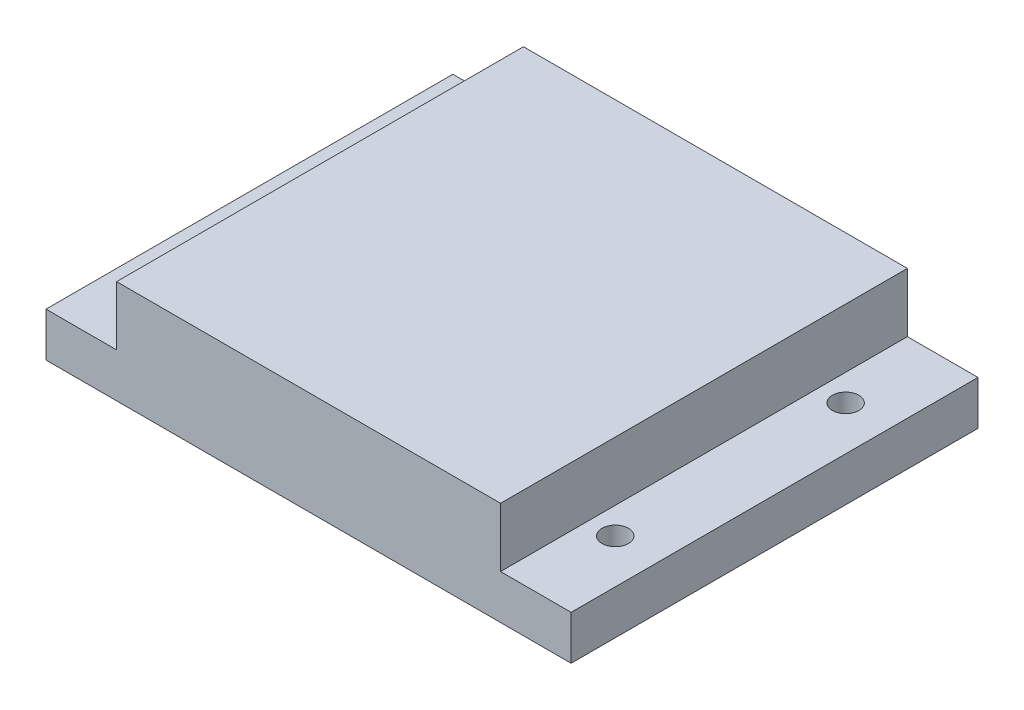
ISO-10303-21;
HEADER;
FILE_DESCRIPTION(('STEP AP214'),'2;1');
FILE_NAME('part.step','',(''),(''),'','','');
FILE_SCHEMA(('AUTOMOTIVE_DESIGN { 1 0 10303 214 1 1 1 1 }'));
ENDSEC;
DATA;
#1=APPLICATION_CONTEXT('core data for automotive mechanical design processes');
#2=APPLICATION_PROTOCOL_DEFINITION('international standard','automotive_design',2000,#1);
#3=PRODUCT_CONTEXT('',#1,'mechanical');
#4=PRODUCT('Part','Part','',(#3));
#5=PRODUCT_RELATED_PRODUCT_CATEGORY('part','',(#4));
#6=PRODUCT_DEFINITION_FORMATION('','',#4);
#7=PRODUCT_DEFINITION_CONTEXT('part definition',#1,'design');
#8=PRODUCT_DEFINITION('design','',#6,#7);
#9=PRODUCT_DEFINITION_SHAPE('','',#8);
#10=(LENGTH_UNIT() NAMED_UNIT(*) SI_UNIT(.MILLI.,.METRE.));
#11=(NAMED_UNIT(*) PLANE_ANGLE_UNIT() SI_UNIT($,.RADIAN.));
#12=(NAMED_UNIT(*) SI_UNIT($,.STERADIAN.) SOLID_ANGLE_UNIT());
#13=UNCERTAINTY_MEASURE_WITH_UNIT(LENGTH_MEASURE(1.E-05),#10,'distance_accuracy_value','');
#14=(GEOMETRIC_REPRESENTATION_CONTEXT(3) GLOBAL_UNCERTAINTY_ASSIGNED_CONTEXT((#13)) GLOBAL_UNIT_ASSIGNED_CONTEXT((#10,
#11,#12)) REPRESENTATION_CONTEXT('',''));
#15=CARTESIAN_POINT('',(0.,0.,0.));
#16=DIRECTION('',(0.,0.,1.));
#17=DIRECTION('',(1.,0.,0.));
#18=AXIS2_PLACEMENT_3D('',#15,#16,#17);
#19=CARTESIAN_POINT('',(0.,0.,46.1));
#20=DIRECTION('',(0.,1.,0.));
#21=DIRECTION('',(0.,0.,1.));
#22=AXIS2_PLACEMENT_3D('',#19,#20,#21);
#23=PLANE('',#22);
#24=CARTESIAN_POINT('',(5.,0.,10.));
#25=DIRECTION('',(0.,-1.,0.));
#26=DIRECTION('',(0.,0.,-1.));
#27=AXIS2_PLACEMENT_3D('',#24,#25,#26);
#28=CIRCLE('',#27,1.5);
#29=CARTESIAN_POINT('',(5.,0.,8.5));
#30=VERTEX_POINT('',#29);
#31=EDGE_CURVE('E198',#30,#30,#28,.T.);
#32=ORIENTED_EDGE('',*,*,#31,.F.);
#33=EDGE_LOOP('',(#32));
#34=FACE_BOUND('',#33,.T.);
#35=CARTESIAN_POINT('',(54.5,0.,36.1));
#36=DIRECTION('',(0.,-1.,0.));
#37=DIRECTION('',(0.,0.,-1.));
#38=AXIS2_PLACEMENT_3D('',#35,#36,#37);
#39=CIRCLE('',#38,1.5);
#40=CARTESIAN_POINT('',(54.5,0.,34.6));
#41=VERTEX_POINT('',#40);
#42=EDGE_CURVE('E201',#41,#41,#39,.T.);
#43=ORIENTED_EDGE('',*,*,#42,.F.);
#44=EDGE_LOOP('',(#43));
#45=FACE_BOUND('',#44,.T.);
#46=CARTESIAN_POINT('',(54.5,0.,10.));
#47=DIRECTION('',(0.,-1.,0.));
#48=DIRECTION('',(0.,0.,-1.));
#49=AXIS2_PLACEMENT_3D('',#46,#47,#48);
#50=CIRCLE('',#49,1.5);
#51=CARTESIAN_POINT('',(54.5,0.,8.5));
#52=VERTEX_POINT('',#51);
#53=EDGE_CURVE('E205',#52,#52,#50,.T.);
#54=ORIENTED_EDGE('',*,*,#53,.F.);
#55=EDGE_LOOP('',(#54));
#56=FACE_BOUND('',#55,.T.);
#57=CARTESIAN_POINT('',(5.,0.,36.1));
#58=DIRECTION('',(0.,-1.,0.));
#59=DIRECTION('',(0.,0.,-1.));
#60=AXIS2_PLACEMENT_3D('',#57,#58,#59);
#61=CIRCLE('',#60,1.5);
#62=CARTESIAN_POINT('',(5.,0.,34.6));
#63=VERTEX_POINT('',#62);
#64=EDGE_CURVE('E164',#63,#63,#61,.T.);
#65=ORIENTED_EDGE('',*,*,#64,.F.);
#66=EDGE_LOOP('',(#65));
#67=FACE_BOUND('',#66,.T.);
#68=DIRECTION('',(1.,0.,0.));
#69=VECTOR('',#68,1.);
#70=CARTESIAN_POINT('',(0.,0.,0.));
#71=LINE('',#70,#69);
#72=CARTESIAN_POINT('',(0.,0.,0.));
#73=VERTEX_POINT('',#72);
#74=CARTESIAN_POINT('',(59.5,0.,0.));
#75=VERTEX_POINT('',#74);
#76=EDGE_CURVE('E134',#73,#75,#71,.T.);
#77=ORIENTED_EDGE('',*,*,#76,.T.);
#78=DIRECTION('',(0.,0.,-1.));
#79=VECTOR('',#78,1.);
#80=CARTESIAN_POINT('',(59.5,0.,46.1));
#81=LINE('',#80,#79);
#82=CARTESIAN_POINT('',(59.5,0.,46.1));
#83=VERTEX_POINT('',#82);
#84=EDGE_CURVE('E11',#83,#75,#81,.T.);
#85=ORIENTED_EDGE('',*,*,#84,.F.);
#86=DIRECTION('',(1.,0.,0.));
#87=VECTOR('',#86,1.);
#88=CARTESIAN_POINT('',(0.,0.,46.1));
#89=LINE('',#88,#87);
#90=CARTESIAN_POINT('',(0.,0.,46.1));
#91=VERTEX_POINT('',#90);
#92=EDGE_CURVE('E148',#91,#83,#89,.T.);
#93=ORIENTED_EDGE('',*,*,#92,.F.);
#94=DIRECTION('',(0.,0.,-1.));
#95=VECTOR('',#94,1.);
#96=CARTESIAN_POINT('',(0.,0.,46.1));
#97=LINE('',#96,#95);
#98=EDGE_CURVE('E130',#91,#73,#97,.T.);
#99=ORIENTED_EDGE('',*,*,#98,.T.);
#100=EDGE_LOOP('',(#77,#85,#93,#99));
#101=FACE_BOUND('',#100,.T.);
#102=ADVANCED_FACE('F36',(#34,#45,#56,#67,#101),#23,.F.);
#103=CARTESIAN_POINT('',(59.5,0.,46.1));
#104=DIRECTION('',(-1.,0.,0.));
#105=DIRECTION('',(0.,0.,1.));
#106=AXIS2_PLACEMENT_3D('',#103,#104,#105);
#107=PLANE('',#106);
#108=DIRECTION('',(0.,1.,0.));
#109=VECTOR('',#108,1.);
#110=CARTESIAN_POINT('',(59.5,0.,0.));
#111=LINE('',#110,#109);
#112=CARTESIAN_POINT('',(59.5,5.,0.));
#113=VERTEX_POINT('',#112);
#114=EDGE_CURVE('E137',#75,#113,#111,.T.);
#115=ORIENTED_EDGE('',*,*,#114,.T.);
#116=DIRECTION('',(0.,0.,-1.));
#117=VECTOR('',#116,1.);
#118=CARTESIAN_POINT('',(59.5,5.,46.1));
#119=LINE('',#118,#117);
#120=CARTESIAN_POINT('',(59.5,5.,46.1));
#121=VERTEX_POINT('',#120);
#122=EDGE_CURVE('E45',#121,#113,#119,.T.);
#123=ORIENTED_EDGE('',*,*,#122,.F.);
#124=DIRECTION('',(0.,1.,0.));
#125=VECTOR('',#124,1.);
#126=CARTESIAN_POINT('',(59.5,0.,46.1));
#127=LINE('',#126,#125);
#128=EDGE_CURVE('E97',#83,#121,#127,.T.);
#129=ORIENTED_EDGE('',*,*,#128,.F.);
#130=ORIENTED_EDGE('',*,*,#84,.T.);
#131=EDGE_LOOP('',(#115,#123,#129,#130));
#132=FACE_BOUND('',#131,.T.);
#133=ADVANCED_FACE('F190',(#132),#107,.F.);
#134=CARTESIAN_POINT('',(59.5,5.,46.1));
#135=DIRECTION('',(0.,-1.,0.));
#136=DIRECTION('',(0.,0.,-1.));
#137=AXIS2_PLACEMENT_3D('',#134,#135,#136);
#138=PLANE('',#137);
#139=CARTESIAN_POINT('',(54.5,5.,36.1));
#140=DIRECTION('',(0.,-1.,0.));
#141=DIRECTION('',(0.,0.,-1.));
#142=AXIS2_PLACEMENT_3D('',#139,#140,#141);
#143=CIRCLE('',#142,1.5);
#144=CARTESIAN_POINT('',(54.5,5.,34.6));
#145=VERTEX_POINT('',#144);
#146=EDGE_CURVE('E39',#145,#145,#143,.T.);
#147=ORIENTED_EDGE('',*,*,#146,.T.);
#148=EDGE_LOOP('',(#147));
#149=FACE_BOUND('',#148,.T.);
#150=CARTESIAN_POINT('',(54.5,5.,10.));
#151=DIRECTION('',(0.,-1.,0.));
#152=DIRECTION('',(0.,0.,-1.));
#153=AXIS2_PLACEMENT_3D('',#150,#151,#152);
#154=CIRCLE('',#153,1.5);
#155=CARTESIAN_POINT('',(54.5,5.,8.5));
#156=VERTEX_POINT('',#155);
#157=EDGE_CURVE('E166',#156,#156,#154,.T.);
#158=ORIENTED_EDGE('',*,*,#157,.T.);
#159=EDGE_LOOP('',(#158));
#160=FACE_BOUND('',#159,.T.);
#161=DIRECTION('',(-1.,0.,0.));
#162=VECTOR('',#161,1.);
#163=CARTESIAN_POINT('',(59.5,5.,0.));
#164=LINE('',#163,#162);
#165=CARTESIAN_POINT('',(51.5,5.,0.));
#166=VERTEX_POINT('',#165);
#167=EDGE_CURVE('E139',#113,#166,#164,.T.);
#168=ORIENTED_EDGE('',*,*,#167,.T.);
#169=DIRECTION('',(0.,0.,-1.));
#170=VECTOR('',#169,1.);
#171=CARTESIAN_POINT('',(51.5,5.,46.1));
#172=LINE('',#171,#170);
#173=CARTESIAN_POINT('',(51.5,5.,46.1));
#174=VERTEX_POINT('',#173);
#175=EDGE_CURVE('E155',#174,#166,#172,.T.);
#176=ORIENTED_EDGE('',*,*,#175,.F.);
#177=DIRECTION('',(-1.,0.,0.));
#178=VECTOR('',#177,1.);
#179=CARTESIAN_POINT('',(59.5,5.,46.1));
#180=LINE('',#179,#178);
#181=EDGE_CURVE('E219',#121,#174,#180,.T.);
#182=ORIENTED_EDGE('',*,*,#181,.F.);
#183=ORIENTED_EDGE('',*,*,#122,.T.);
#184=EDGE_LOOP('',(#168,#176,#182,#183));
#185=FACE_BOUND('',#184,.T.);
#186=ADVANCED_FACE('F173',(#149,#160,#185),#138,.F.);
#187=CARTESIAN_POINT('',(51.5,11.7,46.1));
#188=DIRECTION('',(-1.,0.,0.));
#189=DIRECTION('',(0.,0.,1.));
#190=AXIS2_PLACEMENT_3D('',#187,#188,#189);
#191=PLANE('',#190);
#192=DIRECTION('',(0.,1.,0.));
#193=VECTOR('',#192,1.);
#194=CARTESIAN_POINT('',(51.5,11.7,0.));
#195=LINE('',#194,#193);
#196=CARTESIAN_POINT('',(51.5,11.7,0.));
#197=VERTEX_POINT('',#196);
#198=EDGE_CURVE('E141',#166,#197,#195,.T.);
#199=ORIENTED_EDGE('',*,*,#198,.T.);
#200=DIRECTION('',(0.,0.,-1.));
#201=VECTOR('',#200,1.);
#202=CARTESIAN_POINT('',(51.5,11.7,46.1));
#203=LINE('',#202,#201);
#204=CARTESIAN_POINT('',(51.5,11.7,46.1));
#205=VERTEX_POINT('',#204);
#206=EDGE_CURVE('E152',#205,#197,#203,.T.);
#207=ORIENTED_EDGE('',*,*,#206,.F.);
#208=DIRECTION('',(0.,1.,0.));
#209=VECTOR('',#208,1.);
#210=CARTESIAN_POINT('',(51.5,11.7,46.1));
#211=LINE('',#210,#209);
#212=EDGE_CURVE('E221',#174,#205,#211,.T.);
#213=ORIENTED_EDGE('',*,*,#212,.F.);
#214=ORIENTED_EDGE('',*,*,#175,.T.);
#215=EDGE_LOOP('',(#199,#207,#213,#214));
#216=FACE_BOUND('',#215,.T.);
#217=ADVANCED_FACE('F259',(#216),#191,.F.);
#218=CARTESIAN_POINT('',(8.,11.7,46.1));
#219=DIRECTION('',(0.,-1.,0.));
#220=DIRECTION('',(0.,0.,-1.));
#221=AXIS2_PLACEMENT_3D('',#218,#219,#220);
#222=PLANE('',#221);
#223=DIRECTION('',(-1.,0.,0.));
#224=VECTOR('',#223,1.);
#225=CARTESIAN_POINT('',(8.,11.7,0.));
#226=LINE('',#225,#224);
#227=CARTESIAN_POINT('',(8.,11.7,0.));
#228=VERTEX_POINT('',#227);
#229=EDGE_CURVE('E143',#197,#228,#226,.T.);
#230=ORIENTED_EDGE('',*,*,#229,.T.);
#231=DIRECTION('',(0.,0.,-1.));
#232=VECTOR('',#231,1.);
#233=CARTESIAN_POINT('',(8.,11.7,46.1));
#234=LINE('',#233,#232);
#235=CARTESIAN_POINT('',(8.,11.7,46.1));
#236=VERTEX_POINT('',#235);
#237=EDGE_CURVE('E125',#236,#228,#234,.T.);
#238=ORIENTED_EDGE('',*,*,#237,.F.);
#239=DIRECTION('',(-1.,0.,0.));
#240=VECTOR('',#239,1.);
#241=CARTESIAN_POINT('',(8.,11.7,46.1));
#242=LINE('',#241,#240);
#243=EDGE_CURVE('E116',#205,#236,#242,.T.);
#244=ORIENTED_EDGE('',*,*,#243,.F.);
#245=ORIENTED_EDGE('',*,*,#206,.T.);
#246=EDGE_LOOP('',(#230,#238,#244,#245));
#247=FACE_BOUND('',#246,.T.);
#248=ADVANCED_FACE('F256',(#247),#222,.F.);
#249=CARTESIAN_POINT('',(8.,5.,46.1));
#250=DIRECTION('',(1.,0.,0.));
#251=DIRECTION('',(0.,0.,-1.));
#252=AXIS2_PLACEMENT_3D('',#249,#250,#251);
#253=PLANE('',#252);
#254=DIRECTION('',(0.,-1.,0.));
#255=VECTOR('',#254,1.);
#256=CARTESIAN_POINT('',(8.,5.,0.));
#257=LINE('',#256,#255);
#258=CARTESIAN_POINT('',(8.,5.,0.));
#259=VERTEX_POINT('',#258);
#260=EDGE_CURVE('E124',#228,#259,#257,.T.);
#261=ORIENTED_EDGE('',*,*,#260,.T.);
#262=DIRECTION('',(0.,0.,-1.));
#263=VECTOR('',#262,1.);
#264=CARTESIAN_POINT('',(8.,5.,46.1));
#265=LINE('',#264,#263);
#266=CARTESIAN_POINT('',(8.,5.,46.1));
#267=VERTEX_POINT('',#266);
#268=EDGE_CURVE('E121',#267,#259,#265,.T.);
#269=ORIENTED_EDGE('',*,*,#268,.F.);
#270=DIRECTION('',(0.,-1.,0.));
#271=VECTOR('',#270,1.);
#272=CARTESIAN_POINT('',(8.,5.,46.1));
#273=LINE('',#272,#271);
#274=EDGE_CURVE('E110',#236,#267,#273,.T.);
#275=ORIENTED_EDGE('',*,*,#274,.F.);
#276=ORIENTED_EDGE('',*,*,#237,.T.);
#277=EDGE_LOOP('',(#261,#269,#275,#276));
#278=FACE_BOUND('',#277,.T.);
#279=ADVANCED_FACE('F122',(#278),#253,.F.);
#280=CARTESIAN_POINT('',(0.,5.,46.1));
#281=DIRECTION('',(0.,-1.,0.));
#282=DIRECTION('',(0.,0.,-1.));
#283=AXIS2_PLACEMENT_3D('',#280,#281,#282);
#284=PLANE('',#283);
#285=CARTESIAN_POINT('',(5.,5.,10.));
#286=DIRECTION('',(0.,-1.,0.));
#287=DIRECTION('',(0.,0.,-1.));
#288=AXIS2_PLACEMENT_3D('',#285,#286,#287);
#289=CIRCLE('',#288,1.5);
#290=CARTESIAN_POINT('',(5.,5.,8.5));
#291=VERTEX_POINT('',#290);
#292=EDGE_CURVE('E163',#291,#291,#289,.T.);
#293=ORIENTED_EDGE('',*,*,#292,.T.);
#294=EDGE_LOOP('',(#293));
#295=FACE_BOUND('',#294,.T.);
#296=CARTESIAN_POINT('',(5.,5.,36.1));
#297=DIRECTION('',(0.,-1.,0.));
#298=DIRECTION('',(0.,0.,-1.));
#299=AXIS2_PLACEMENT_3D('',#296,#297,#298);
#300=CIRCLE('',#299,1.5);
#301=CARTESIAN_POINT('',(5.,5.,34.6));
#302=VERTEX_POINT('',#301);
#303=EDGE_CURVE('E160',#302,#302,#300,.T.);
#304=ORIENTED_EDGE('',*,*,#303,.T.);
#305=EDGE_LOOP('',(#304));
#306=FACE_BOUND('',#305,.T.);
#307=DIRECTION('',(-1.,0.,0.));
#308=VECTOR('',#307,1.);
#309=CARTESIAN_POINT('',(0.,5.,0.));
#310=LINE('',#309,#308);
#311=CARTESIAN_POINT('',(0.,5.,0.));
#312=VERTEX_POINT('',#311);
#313=EDGE_CURVE('E83',#259,#312,#310,.T.);
#314=ORIENTED_EDGE('',*,*,#313,.T.);
#315=DIRECTION('',(0.,0.,-1.));
#316=VECTOR('',#315,1.);
#317=CARTESIAN_POINT('',(0.,5.,46.1));
#318=LINE('',#317,#316);
#319=CARTESIAN_POINT('',(0.,5.,46.1));
#320=VERTEX_POINT('',#319);
#321=EDGE_CURVE('E126',#320,#312,#318,.T.);
#322=ORIENTED_EDGE('',*,*,#321,.F.);
#323=DIRECTION('',(-1.,0.,0.));
#324=VECTOR('',#323,1.);
#325=CARTESIAN_POINT('',(0.,5.,46.1));
#326=LINE('',#325,#324);
#327=EDGE_CURVE('E114',#267,#320,#326,.T.);
#328=ORIENTED_EDGE('',*,*,#327,.F.);
#329=ORIENTED_EDGE('',*,*,#268,.T.);
#330=EDGE_LOOP('',(#314,#322,#328,#329));
#331=FACE_BOUND('',#330,.T.);
#332=ADVANCED_FACE('F128',(#295,#306,#331),#284,.F.);
#333=CARTESIAN_POINT('',(0.,0.,46.1));
#334=DIRECTION('',(1.,0.,0.));
#335=DIRECTION('',(0.,0.,-1.));
#336=AXIS2_PLACEMENT_3D('',#333,#334,#335);
#337=PLANE('',#336);
#338=DIRECTION('',(0.,-1.,0.));
#339=VECTOR('',#338,1.);
#340=CARTESIAN_POINT('',(0.,0.,0.));
#341=LINE('',#340,#339);
#342=EDGE_CURVE('E89',#312,#73,#341,.T.);
#343=ORIENTED_EDGE('',*,*,#342,.T.);
#344=ORIENTED_EDGE('',*,*,#98,.F.);
#345=DIRECTION('',(0.,-1.,0.));
#346=VECTOR('',#345,1.);
#347=CARTESIAN_POINT('',(0.,0.,46.1));
#348=LINE('',#347,#346);
#349=EDGE_CURVE('E54',#320,#91,#348,.T.);
#350=ORIENTED_EDGE('',*,*,#349,.F.);
#351=ORIENTED_EDGE('',*,*,#321,.T.);
#352=EDGE_LOOP('',(#343,#344,#350,#351));
#353=FACE_BOUND('',#352,.T.);
#354=ADVANCED_FACE('F239',(#353),#337,.F.);
#355=CARTESIAN_POINT('',(0.,0.,46.1));
#356=DIRECTION('',(0.,0.,1.));
#357=DIRECTION('',(1.,0.,0.));
#358=AXIS2_PLACEMENT_3D('',#355,#356,#357);
#359=PLANE('',#358);
#360=ORIENTED_EDGE('',*,*,#92,.T.);
#361=ORIENTED_EDGE('',*,*,#128,.T.);
#362=ORIENTED_EDGE('',*,*,#181,.T.);
#363=ORIENTED_EDGE('',*,*,#212,.T.);
#364=ORIENTED_EDGE('',*,*,#243,.T.);
#365=ORIENTED_EDGE('',*,*,#274,.T.);
#366=ORIENTED_EDGE('',*,*,#327,.T.);
#367=ORIENTED_EDGE('',*,*,#349,.T.);
#368=EDGE_LOOP('',(#360,#361,#362,#363,#364,#365,#366,#367));
#369=FACE_BOUND('',#368,.T.);
#370=ADVANCED_FACE('F112',(#369),#359,.T.);
#371=CARTESIAN_POINT('',(0.,0.,0.));
#372=DIRECTION('',(0.,0.,1.));
#373=DIRECTION('',(1.,0.,0.));
#374=AXIS2_PLACEMENT_3D('',#371,#372,#373);
#375=PLANE('',#374);
#376=ORIENTED_EDGE('',*,*,#76,.F.);
#377=ORIENTED_EDGE('',*,*,#342,.F.);
#378=ORIENTED_EDGE('',*,*,#313,.F.);
#379=ORIENTED_EDGE('',*,*,#260,.F.);
#380=ORIENTED_EDGE('',*,*,#229,.F.);
#381=ORIENTED_EDGE('',*,*,#198,.F.);
#382=ORIENTED_EDGE('',*,*,#167,.F.);
#383=ORIENTED_EDGE('',*,*,#114,.F.);
#384=EDGE_LOOP('',(#376,#377,#378,#379,#380,#381,#382,#383));
#385=FACE_BOUND('',#384,.T.);
#386=ADVANCED_FACE('F213',(#385),#375,.F.);
#387=CARTESIAN_POINT('',(5.,11.7,36.1));
#388=DIRECTION('',(0.,-1.,0.));
#389=DIRECTION('',(0.,0.,-1.));
#390=AXIS2_PLACEMENT_3D('',#387,#388,#389);
#391=CYLINDRICAL_SURFACE('',#390,1.5);
#392=ORIENTED_EDGE('',*,*,#64,.T.);
#393=EDGE_LOOP('',(#392));
#394=FACE_BOUND('',#393,.T.);
#395=ORIENTED_EDGE('',*,*,#303,.F.);
#396=EDGE_LOOP('',(#395));
#397=FACE_BOUND('',#396,.T.);
#398=ADVANCED_FACE('F234',(#394,#397),#391,.F.);
#399=CARTESIAN_POINT('',(5.,11.7,10.));
#400=DIRECTION('',(0.,-1.,0.));
#401=DIRECTION('',(0.,0.,-1.));
#402=AXIS2_PLACEMENT_3D('',#399,#400,#401);
#403=CYLINDRICAL_SURFACE('',#402,1.5);
#404=ORIENTED_EDGE('',*,*,#31,.T.);
#405=EDGE_LOOP('',(#404));
#406=FACE_BOUND('',#405,.T.);
#407=ORIENTED_EDGE('',*,*,#292,.F.);
#408=EDGE_LOOP('',(#407));
#409=FACE_BOUND('',#408,.T.);
#410=ADVANCED_FACE('F183',(#406,#409),#403,.F.);
#411=CARTESIAN_POINT('',(54.5,11.7,10.));
#412=DIRECTION('',(0.,-1.,0.));
#413=DIRECTION('',(0.,0.,-1.));
#414=AXIS2_PLACEMENT_3D('',#411,#412,#413);
#415=CYLINDRICAL_SURFACE('',#414,1.5);
#416=ORIENTED_EDGE('',*,*,#53,.T.);
#417=EDGE_LOOP('',(#416));
#418=FACE_BOUND('',#417,.T.);
#419=ORIENTED_EDGE('',*,*,#157,.F.);
#420=EDGE_LOOP('',(#419));
#421=FACE_BOUND('',#420,.T.);
#422=ADVANCED_FACE('F177',(#418,#421),#415,.F.);
#423=CARTESIAN_POINT('',(54.5,11.7,36.1));
#424=DIRECTION('',(0.,-1.,0.));
#425=DIRECTION('',(0.,0.,-1.));
#426=AXIS2_PLACEMENT_3D('',#423,#424,#425);
#427=CYLINDRICAL_SURFACE('',#426,1.5);
#428=ORIENTED_EDGE('',*,*,#42,.T.);
#429=EDGE_LOOP('',(#428));
#430=FACE_BOUND('',#429,.T.);
#431=ORIENTED_EDGE('',*,*,#146,.F.);
#432=EDGE_LOOP('',(#431));
#433=FACE_BOUND('',#432,.T.);
#434=ADVANCED_FACE('F175',(#430,#433),#427,.F.);
#435=CLOSED_SHELL('',(#102,#133,#186,#217,#248,#279,#332,#354,#370,#386,#398,#410,#422,#434));
#436=MANIFOLD_SOLID_BREP('B2',#435);
#437=ADVANCED_BREP_SHAPE_REPRESENTATION('',(#18,#436),#14);
#438=SHAPE_DEFINITION_REPRESENTATION(#9,#437);
ENDSEC;
END-ISO-10303-21;
